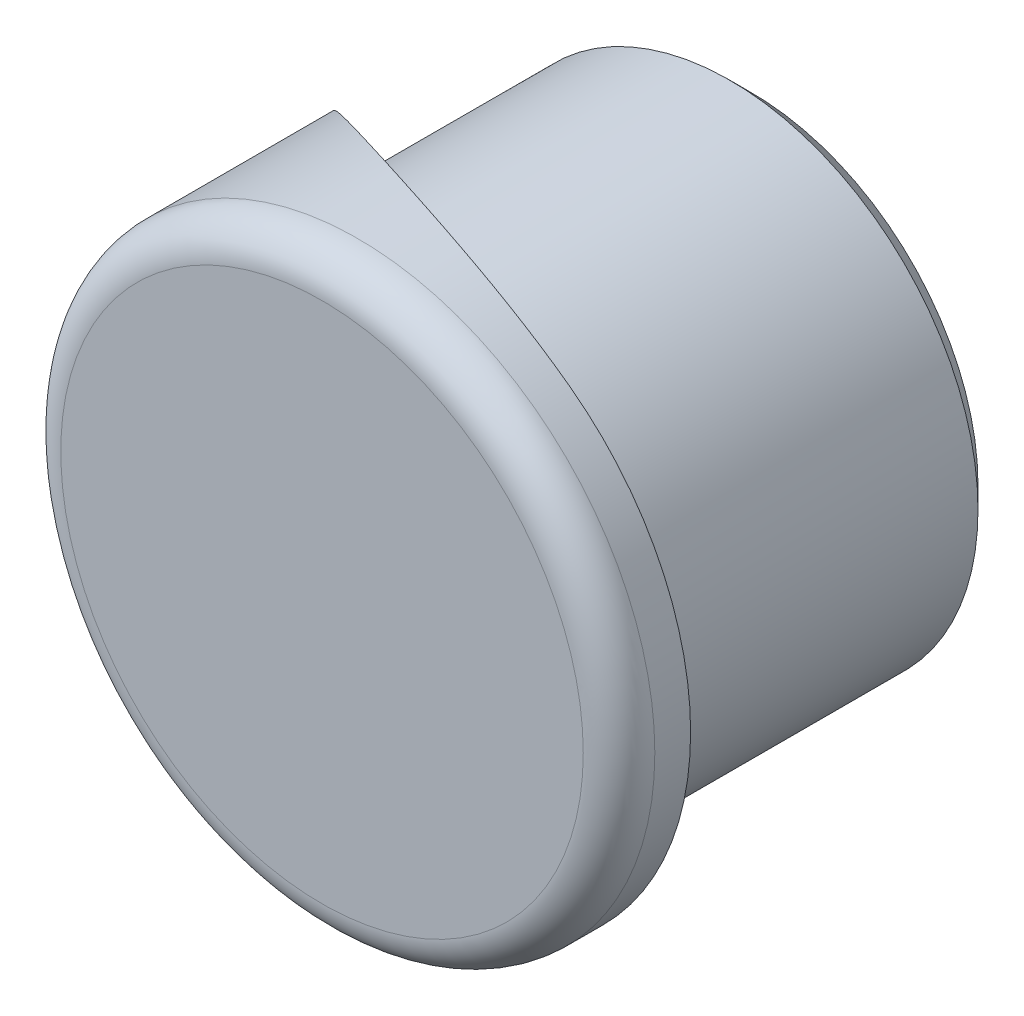
ISO-10303-21;
HEADER;
FILE_DESCRIPTION(('STEP AP214'),'2;1');
FILE_NAME('part.step','',(''),(''),'','','');
FILE_SCHEMA(('AUTOMOTIVE_DESIGN { 1 0 10303 214 1 1 1 1 }'));
ENDSEC;
DATA;
#1=APPLICATION_CONTEXT('core data for automotive mechanical design processes');
#2=APPLICATION_PROTOCOL_DEFINITION('international standard','automotive_design',2000,#1);
#3=PRODUCT_CONTEXT('',#1,'mechanical');
#4=PRODUCT('Part','Part','',(#3));
#5=PRODUCT_RELATED_PRODUCT_CATEGORY('part','',(#4));
#6=PRODUCT_DEFINITION_FORMATION('','',#4);
#7=PRODUCT_DEFINITION_CONTEXT('part definition',#1,'design');
#8=PRODUCT_DEFINITION('design','',#6,#7);
#9=PRODUCT_DEFINITION_SHAPE('','',#8);
#10=(LENGTH_UNIT() NAMED_UNIT(*) SI_UNIT(.MILLI.,.METRE.));
#11=(NAMED_UNIT(*) PLANE_ANGLE_UNIT() SI_UNIT($,.RADIAN.));
#12=(NAMED_UNIT(*) SI_UNIT($,.STERADIAN.) SOLID_ANGLE_UNIT());
#13=UNCERTAINTY_MEASURE_WITH_UNIT(LENGTH_MEASURE(1.E-05),#10,'distance_accuracy_value','');
#14=(GEOMETRIC_REPRESENTATION_CONTEXT(3) GLOBAL_UNCERTAINTY_ASSIGNED_CONTEXT((#13)) GLOBAL_UNIT_ASSIGNED_CONTEXT((#10,
#11,#12)) REPRESENTATION_CONTEXT('',''));
#15=CARTESIAN_POINT('',(0.,0.,0.));
#16=DIRECTION('',(0.,0.,1.));
#17=DIRECTION('',(1.,0.,0.));
#18=AXIS2_PLACEMENT_3D('',#15,#16,#17);
#19=CARTESIAN_POINT('',(-38.,67.,-5.));
#20=DIRECTION('',(0.,0.,1.));
#21=DIRECTION('',(1.,0.,0.));
#22=AXIS2_PLACEMENT_3D('',#19,#20,#21);
#23=CYLINDRICAL_SURFACE('',#22,3.46500000000001);
#24=DIRECTION('',(0.,0.,-1.));
#25=VECTOR('',#24,1.);
#26=CARTESIAN_POINT('',(-39.1601724009818,63.735,1.001));
#27=LINE('',#26,#25);
#28=CARTESIAN_POINT('',(-39.1601724009818,63.735,-0.868511721726009));
#29=VERTEX_POINT('',#28);
#30=CARTESIAN_POINT('',(-39.1601724009818,63.735,-4.69999999999999));
#31=VERTEX_POINT('',#30);
#32=EDGE_CURVE('E64',#29,#31,#27,.T.);
#33=ORIENTED_EDGE('',*,*,#32,.F.);
#34=CARTESIAN_POINT('',(-34.535,67.,-0.0627460668062279));
#35=CARTESIAN_POINT('',(-34.5350074828583,67.1943183308261,-0.0627397452340194));
#36=CARTESIAN_POINT('',(-34.5513990512724,67.3887328090735,-0.0606269218541209));
#37=CARTESIAN_POINT('',(-34.6165187684491,67.772108769898,-0.0528352769750474));
#38=CARTESIAN_POINT('',(-34.6652751803534,67.9610653356292,-0.0471533389198429));
#39=CARTESIAN_POINT('',(-34.7936863440667,68.3279771907534,-0.0341609407357478));
#40=CARTESIAN_POINT('',(-34.8733210423474,68.5059395334273,-0.0268515388525732));
#41=CARTESIAN_POINT('',(-35.0612788571828,68.8460481785124,-0.0134847235247043));
#42=CARTESIAN_POINT('',(-35.1695999040446,69.0081956207992,-0.00742721981286336));
#43=CARTESIAN_POINT('',(-35.4122908531092,69.3125673295976,-1.9848824931374E-05));
#44=CARTESIAN_POINT('',(-35.546732197894,69.4547350679029,0.0013169097626798));
#45=CARTESIAN_POINT('',(-35.8375088326983,69.714372122949,-0.00440306185730182));
#46=CARTESIAN_POINT('',(-35.9938382449217,69.8318480492864,-0.0114575424909256));
#47=CARTESIAN_POINT('',(-36.31859981879,70.0355890530537,-0.036853762193926));
#48=CARTESIAN_POINT('',(-36.4865560772856,70.1226528711044,-0.0548658642650128));
#49=CARTESIAN_POINT('',(-36.8327006568094,70.267849108929,-0.104021667804737));
#50=CARTESIAN_POINT('',(-37.0108858426261,70.3259903413503,-0.135161363975472));
#51=CARTESIAN_POINT('',(-37.364996887556,70.4110107857854,-0.21008917513056));
#52=CARTESIAN_POINT('',(-37.5407801681011,70.4389218816817,-0.2533915695267));
#53=CARTESIAN_POINT('',(-37.8909586667489,70.4677400662849,-0.352608484270348));
#54=CARTESIAN_POINT('',(-38.0653536221502,70.4686421602736,-0.40852533545669));
#55=CARTESIAN_POINT('',(-38.4143697719475,70.4447364380946,-0.533754545200209));
#56=CARTESIAN_POINT('',(-38.5887810118977,70.4190185979353,-0.603470578814305));
#57=CARTESIAN_POINT('',(-38.9277159067129,70.3430178646755,-0.752667993712221));
#58=CARTESIAN_POINT('',(-39.092236922051,70.2927284462526,-0.832151964807883));
#59=CARTESIAN_POINT('',(-39.4287056141085,70.1625175806226,-1.0086124809165));
#60=CARTESIAN_POINT('',(-39.5990231124474,70.0796840590618,-1.1065345077834));
#61=CARTESIAN_POINT('',(-39.9221112028096,69.8891109002179,-1.30750476649196));
#62=CARTESIAN_POINT('',(-40.0748573789693,69.7813372190298,-1.41055985279682));
#63=CARTESIAN_POINT('',(-40.3001850192607,69.5936179275805,-1.57323034339637));
#64=CARTESIAN_POINT('',(-40.3792934508889,69.5212519080298,-1.63273487209901));
#65=CARTESIAN_POINT('',(-40.5308171263053,69.3691176199974,-1.75091764445916));
#66=CARTESIAN_POINT('',(-40.6032306910346,69.2893475045818,-1.80959567772242));
#67=CARTESIAN_POINT('',(-40.7408738750764,69.122618768717,-1.92489269931408));
#68=CARTESIAN_POINT('',(-40.8061108066616,69.0356676262202,-1.98151374335076));
#69=CARTESIAN_POINT('',(-40.9289667402705,68.8545490171092,-2.09136921523375));
#70=CARTESIAN_POINT('',(-40.9865864509023,68.7603822230355,-2.14460395785853));
#71=CARTESIAN_POINT('',(-41.1116413069467,68.5317208403521,-2.26320911837599));
#72=CARTESIAN_POINT('',(-41.1758098508866,68.3943546593738,-2.32659840662755));
#73=CARTESIAN_POINT('',(-41.2868414246971,68.1074524539752,-2.43919059384887));
#74=CARTESIAN_POINT('',(-41.333739297442,67.95794168332,-2.48842201126488));
#75=CARTESIAN_POINT('',(-41.4012381027768,67.674752310029,-2.56039661183033));
#76=CARTESIAN_POINT('',(-41.4249243390676,67.5426047389453,-2.58619187321985));
#77=CARTESIAN_POINT('',(-41.4567595673716,67.2742959208186,-2.62102705602521));
#78=CARTESIAN_POINT('',(-41.4649223706207,67.1381383511286,-2.63008187125645));
#79=CARTESIAN_POINT('',(-41.4650766190862,66.8656077721054,-2.63025221382331));
#80=CARTESIAN_POINT('',(-41.4570452369416,66.7292347297963,-2.62134241820288));
#81=CARTESIAN_POINT('',(-41.4254201773638,66.4604752519239,-2.58673186010538));
#82=CARTESIAN_POINT('',(-41.4018116476935,66.3280927472819,-2.56101507300279));
#83=CARTESIAN_POINT('',(-41.3325541106972,66.0365421258207,-2.48714982093731));
#84=CARTESIAN_POINT('',(-41.2827567470808,65.8794185769826,-2.43489480775135));
#85=CARTESIAN_POINT('',(-41.1642447082799,65.5787173885951,-2.31504573198983));
#86=CARTESIAN_POINT('',(-41.0954875341257,65.4351711654703,-2.24741726990643));
#87=CARTESIAN_POINT('',(-40.913507282884,65.1122654062499,-2.07611775918953));
#88=CARTESIAN_POINT('',(-40.7932251351466,64.939085813274,-1.96832580654472));
#89=CARTESIAN_POINT('',(-40.5264718343559,64.6195490537807,-1.74575899307786));
#90=CARTESIAN_POINT('',(-40.3799733639548,64.4732201909091,-1.6309769316767));
#91=CARTESIAN_POINT('',(-40.0602272104819,64.206109621311,-1.39985371892978));
#92=CARTESIAN_POINT('',(-39.8865387642131,64.0858448846385,-1.28352251435435));
#93=CARTESIAN_POINT('',(-39.5168724213005,63.8774596244126,-1.05799081451405));
#94=CARTESIAN_POINT('',(-39.3209217326029,63.7893004057051,-0.948781866413846));
#95=CARTESIAN_POINT('',(-38.9395679022534,63.6596620270591,-0.75793372873985));
#96=CARTESIAN_POINT('',(-38.7567135375312,63.6132869728886,-0.67458942298845));
#97=CARTESIAN_POINT('',(-38.4749071532384,63.5663742667939,-0.559077602265383));
#98=CARTESIAN_POINT('',(-38.3796849409183,63.5545115050318,-0.522147169578461));
#99=CARTESIAN_POINT('',(-38.1873270808172,63.5387238849914,-0.451780194695325));
#100=CARTESIAN_POINT('',(-38.0901922666342,63.5347956425739,-0.418342168731279));
#101=CARTESIAN_POINT('',(-37.8941250605487,63.5352220756273,-0.355053296604298));
#102=CARTESIAN_POINT('',(-37.7951853451538,63.5396270537601,-0.325225399424831));
#103=CARTESIAN_POINT('',(-37.5969727945843,63.5570818269826,-0.269614782513644));
#104=CARTESIAN_POINT('',(-37.4977001325196,63.5701276661709,-0.243830218367751));
#105=CARTESIAN_POINT('',(-37.2997165138212,63.605013853424,-0.196402265872657));
#106=CARTESIAN_POINT('',(-37.2010055156736,63.6268535427222,-0.174758567501237));
#107=CARTESIAN_POINT('',(-37.0051232388711,63.6793488837617,-0.135604839021669));
#108=CARTESIAN_POINT('',(-36.9079518222546,63.7100037408094,-0.118094436552957));
#109=CARTESIAN_POINT('',(-36.7255821639484,63.7765609938262,-0.0886037010025468));
#110=CARTESIAN_POINT('',(-36.6401465121954,63.8116504002299,-0.0762487889400474));
#111=CARTESIAN_POINT('',(-36.4720078635883,63.8887267815483,-0.0546111742862782));
#112=CARTESIAN_POINT('',(-36.3893057627188,63.9307159916252,-0.0453294701950434));
#113=CARTESIAN_POINT('',(-36.2273713900952,64.0213069484541,-0.0296025608239107));
#114=CARTESIAN_POINT('',(-36.1481375229856,64.0699056117538,-0.0231560387730934));
#115=CARTESIAN_POINT('',(-35.9937075690325,64.1733990933973,-0.0127859524565111));
#116=CARTESIAN_POINT('',(-35.918513021294,64.2282962870392,-0.00886334371697891));
#117=CARTESIAN_POINT('',(-35.7019365022556,64.4002488911629,-0.000452683275712521));
#118=CARTESIAN_POINT('',(-35.5671268381139,64.5259318928098,0.000890983295654131));
#119=CARTESIAN_POINT('',(-35.3191900065987,64.7969809115625,-0.00194537570822346));
#120=CARTESIAN_POINT('',(-35.2060703825676,64.9423537464961,-0.00612731899949184));
#121=CARTESIAN_POINT('',(-35.0000954900911,65.2554833843794,-0.0172081562618088));
#122=CARTESIAN_POINT('',(-34.9082748190511,65.4239183380095,-0.0242125059200326));
#123=CARTESIAN_POINT('',(-34.7536950676086,65.7735338348096,-0.0378625625272083));
#124=CARTESIAN_POINT('',(-34.6909147302128,65.9547049430861,-0.0445085286482653));
#125=CARTESIAN_POINT('',(-34.6075076699568,66.2801119756775,-0.0538667703292835));
#126=CARTESIAN_POINT('',(-34.5803609913239,66.4226956706784,-0.0571415069074745));
#127=CARTESIAN_POINT('',(-34.544104460019,66.7101684286885,-0.0615835017525356));
#128=CARTESIAN_POINT('',(-34.5349944185171,66.8550574675466,-0.0627507820828623));
#129=CARTESIAN_POINT('',(-34.535,67.,-0.0627460668062279));
#130=B_SPLINE_CURVE_WITH_KNOTS('',3,(#34,#35,#36,#37,#38,#39,#40,#41,#42,#43,#44,#45,#46,#47,
#48,#49,#50,#51,#52,#53,#54,#55,#56,#57,#58,#59,#60,#61,#62,#63,#64,#65,#66,#67,#68,#69,#70,#71,
#72,#73,#74,#75,#76,#77,#78,#79,#80,#81,#82,#83,#84,#85,#86,#87,#88,#89,#90,#91,#92,#93,#94,#95,
#96,#97,#98,#99,#100,#101,#102,#103,#104,#105,#106,#107,#108,#109,#110,#111,#112,#113,#114,#115,
#116,#117,#118,#119,#120,#121,#122,#123,#124,#125,#126,#127,#128,#129),.UNSPECIFIED.,.T.,.F.,(4,
2,2,2,2,2,2,2,2,2,2,2,2,2,2,2,2,2,2,2,2,2,2,2,2,2,2,2,2,2,2,2,2,2,2,2,2,2,2,2,2,2,2,2,2,2,2,4),
(0.,0.582428361334653,1.16536600827761,1.7479257058215,2.3304433836839,2.91457734547986,
3.4985547444113,4.0657778868494,4.63282809163637,5.17984505785919,5.72696318216146,
6.29342302306707,6.86003337704985,7.49726574457342,8.13537313438889,8.50288714096622,
8.87049307067518,9.23772090803059,9.60491455916375,10.0962387207205,10.5865661539456,
10.9949327909254,11.4029359328357,11.8115145989667,12.2204833938603,12.7363627601776,
13.2534080191204,13.9601295530194,14.6675918230913,15.3880110231279,16.1075590420949,
16.7234233307964,17.0315585676661,17.3395623544863,17.6494313102788,17.9591585018989,
18.2688624954912,18.5785385777975,18.8577476333399,19.1370473164309,19.4162171443392,
19.6954926008281,20.245747786814,20.7961939943224,21.3694615591081,21.9423088358998,
22.3767481660378,22.8111829479015),.UNSPECIFIED.);
#131=CARTESIAN_POINT('',(-35.535,69.4351591323772,0.));
#132=VERTEX_POINT('',#131);
#133=EDGE_CURVE('E103',#132,#29,#130,.T.);
#134=ORIENTED_EDGE('',*,*,#133,.F.);
#135=CARTESIAN_POINT('',(-38.,67.,0.));
#136=DIRECTION('',(0.,0.,1.));
#137=DIRECTION('',(1.,0.,0.));
#138=AXIS2_PLACEMENT_3D('',#135,#136,#137);
#139=CIRCLE('',#138,3.46500000000001);
#140=CARTESIAN_POINT('',(-35.535,64.5648408676228,0.));
#141=VERTEX_POINT('',#140);
#142=EDGE_CURVE('E107',#141,#132,#139,.T.);
#143=ORIENTED_EDGE('',*,*,#142,.F.);
#144=CARTESIAN_POINT('',(-36.8398275990181,63.735,-0.107128219916371));
#145=VERTEX_POINT('',#144);
#146=EDGE_CURVE('E100',#145,#141,#130,.T.);
#147=ORIENTED_EDGE('',*,*,#146,.F.);
#148=DIRECTION('',(0.,0.,-1.));
#149=VECTOR('',#148,1.);
#150=CARTESIAN_POINT('',(-36.8398275990181,63.735,1.001));
#151=LINE('',#150,#149);
#152=CARTESIAN_POINT('',(-36.8398275990181,63.735,-4.69999999999999));
#153=VERTEX_POINT('',#152);
#154=EDGE_CURVE('E88',#145,#153,#151,.T.);
#155=ORIENTED_EDGE('',*,*,#154,.T.);
#156=CARTESIAN_POINT('',(-38.,67.,-4.69999999999999));
#157=DIRECTION('',(0.,0.,1.));
#158=DIRECTION('',(1.,0.,0.));
#159=AXIS2_PLACEMENT_3D('',#156,#157,#158);
#160=CIRCLE('',#159,3.46500000000001);
#161=EDGE_CURVE('E151',#153,#31,#160,.T.);
#162=ORIENTED_EDGE('',*,*,#161,.T.);
#163=EDGE_LOOP('',(#33,#134,#143,#147,#155,#162));
#164=FACE_BOUND('',#163,.T.);
#165=ADVANCED_FACE('F43',(#164),#23,.T.);
#166=CARTESIAN_POINT('',(-38.,67.,-5.));
#167=DIRECTION('',(0.,0.,1.));
#168=DIRECTION('',(1.,0.,0.));
#169=AXIS2_PLACEMENT_3D('',#166,#167,#168);
#170=PLANE('',#169);
#171=CARTESIAN_POINT('',(-38.,67.,-5.));
#172=DIRECTION('',(0.,0.,1.));
#173=DIRECTION('',(1.,0.,0.));
#174=AXIS2_PLACEMENT_3D('',#171,#172,#173);
#175=CIRCLE('',#174,3.165);
#176=CARTESIAN_POINT('',(-34.835,67.,-5.));
#177=VERTEX_POINT('',#176);
#178=EDGE_CURVE('E58',#177,#177,#175,.F.);
#179=ORIENTED_EDGE('',*,*,#178,.T.);
#180=EDGE_LOOP('',(#179));
#181=FACE_BOUND('',#180,.T.);
#182=ADVANCED_FACE('F141',(#181),#170,.F.);
#183=CARTESIAN_POINT('',(-38.,67.,1.));
#184=DIRECTION('',(0.,0.,-1.));
#185=DIRECTION('',(-1.,0.,0.));
#186=AXIS2_PLACEMENT_3D('',#183,#184,#185);
#187=CYLINDRICAL_SURFACE('',#186,4.15);
#188=CARTESIAN_POINT('',(-35.535,70.3386037500728,0.));
#189=CARTESIAN_POINT('',(-35.621149734338,70.4022300541031,9.97788731530421E-06));
#190=CARTESIAN_POINT('',(-35.7097886912923,70.4625032790938,-0.0013910973962824));
#191=CARTESIAN_POINT('',(-35.891390648936,70.5759892293937,-0.00742856745871159));
#192=CARTESIAN_POINT('',(-35.9843543743296,70.6292007655738,-0.0120655063091064));
#193=CARTESIAN_POINT('',(-36.1737808074708,70.7281136031343,-0.0249785700638338));
#194=CARTESIAN_POINT('',(-36.2702380951678,70.7738259769767,-0.0332492621140484));
#195=CARTESIAN_POINT('',(-36.4660193441792,70.8575555819815,-0.0537501990777097));
#196=CARTESIAN_POINT('',(-36.5653430262157,70.8955735599502,-0.065980059420615));
#197=CARTESIAN_POINT('',(-36.7662217798506,70.9637809709194,-0.094659958296088));
#198=CARTESIAN_POINT('',(-36.8677800319631,70.9939583413931,-0.111116422891139));
#199=CARTESIAN_POINT('',(-37.0721860163087,71.0463314618807,-0.148385018139984));
#200=CARTESIAN_POINT('',(-37.1750342117769,71.068524254361,-0.169198758247341));
#201=CARTESIAN_POINT('',(-37.3810719986416,71.1049187619388,-0.215198034918052));
#202=CARTESIAN_POINT('',(-37.484261215346,71.1191274099039,-0.240379753690293));
#203=CARTESIAN_POINT('',(-37.6902892591051,71.1397243925692,-0.295058648039326));
#204=CARTESIAN_POINT('',(-37.7931279378587,71.1461097488914,-0.324557462381094));
#205=CARTESIAN_POINT('',(-38.0990058456441,71.1538016527018,-0.419031722116995));
#206=CARTESIAN_POINT('',(-38.3005323035065,71.1438357568197,-0.490235171971284));
#207=CARTESIAN_POINT('',(-38.6943405827577,71.0963237147095,-0.647198376422936));
#208=CARTESIAN_POINT('',(-38.8866159301259,71.0587585449534,-0.732968139869193));
#209=CARTESIAN_POINT('',(-39.2781994311725,70.9539799333864,-0.926039704851712));
#210=CARTESIAN_POINT('',(-39.4761339998637,70.8840726818758,-1.03465592879544));
#211=CARTESIAN_POINT('',(-39.8541604667197,70.7185018059244,-1.26251460247421));
#212=CARTESIAN_POINT('',(-40.0342444695053,70.6228268532517,-1.38176171039333));
#213=CARTESIAN_POINT('',(-40.4079459669177,70.3884801062175,-1.65044743810582));
#214=CARTESIAN_POINT('',(-40.597605540439,70.2450893914401,-1.80130982383197));
#215=CARTESIAN_POINT('',(-40.8609740919549,70.0085330905618,-2.02943877222425));
#216=CARTESIAN_POINT('',(-40.9453125984398,69.9260151632161,-2.10586015276671));
#217=CARTESIAN_POINT('',(-41.1068429019321,69.7538980227786,-2.25832184520318));
#218=CARTESIAN_POINT('',(-41.1840357200266,69.6642998248284,-2.33436221006925));
#219=CARTESIAN_POINT('',(-41.322570762054,69.48878270077,-2.47617053853203));
#220=CARTESIAN_POINT('',(-41.3847140601796,69.4036332028303,-2.54211094328518));
#221=CARTESIAN_POINT('',(-41.5030491272354,69.227642892924,-2.67176494992621));
#222=CARTESIAN_POINT('',(-41.5592400560847,69.1368012804791,-2.73547823664444));
#223=CARTESIAN_POINT('',(-41.665242949536,68.949376068847,-2.85930466332917));
#224=CARTESIAN_POINT('',(-41.7150655687376,68.8528024669282,-2.91942372451416));
#225=CARTESIAN_POINT('',(-41.8079208632302,68.6535738898166,-3.03452586103224));
#226=CARTESIAN_POINT('',(-41.8509571589748,68.5509221977227,-3.08951166848664));
#227=CARTESIAN_POINT('',(-41.9400020794973,68.3112198172243,-3.2059801401198));
#228=CARTESIAN_POINT('',(-41.9837776461555,68.1722605988536,-3.26532480370467));
#229=CARTESIAN_POINT('',(-42.057303737599,67.8846814589757,-3.36712228618242));
#230=CARTESIAN_POINT('',(-42.0870776996239,67.7360781587154,-3.4096033143421));
#231=CARTESIAN_POINT('',(-42.1196545393601,67.5069889526605,-3.45657818316439));
#232=CARTESIAN_POINT('',(-42.1285179327644,67.4290290907458,-3.46947523080156));
#233=CARTESIAN_POINT('',(-42.1418271981599,67.2719640829614,-3.48890497850318));
#234=CARTESIAN_POINT('',(-42.146275437183,67.1928595738598,-3.49544108872696));
#235=CARTESIAN_POINT('',(-42.1506159921754,67.0342804952256,-3.50181804444513));
#236=CARTESIAN_POINT('',(-42.1505099518333,66.9548060695544,-3.50166130546114));
#237=CARTESIAN_POINT('',(-42.1457577173818,66.7963109065401,-3.49468146207131));
#238=CARTESIAN_POINT('',(-42.1411117739305,66.7172901443915,-3.48785872571004));
#239=CARTESIAN_POINT('',(-42.1226710420433,66.5063084512029,-3.46094321176935));
#240=CARTESIAN_POINT('',(-42.1047767374504,66.3754149384127,-3.43494417526041));
#241=CARTESIAN_POINT('',(-42.0576711373917,66.1197778104037,-3.36789275017013));
#242=CARTESIAN_POINT('',(-42.0284484683299,65.995040518324,-3.3268252351691));
#243=CARTESIAN_POINT('',(-41.938424105908,65.6757216330552,-3.20364868376931));
#244=CARTESIAN_POINT('',(-41.8693552210958,65.4871209147776,-3.11204210216894));
#245=CARTESIAN_POINT('',(-41.7496488275425,65.2189096061747,-2.96191150540608));
#246=CARTESIAN_POINT('',(-41.7069583174388,65.1317901286845,-2.90962708772035));
#247=CARTESIAN_POINT('',(-41.6165209736787,64.9622335423753,-2.80192087720521));
#248=CARTESIAN_POINT('',(-41.5687755986897,64.8797950932582,-2.74649999159404));
#249=CARTESIAN_POINT('',(-41.4454187980974,64.6825269922964,-2.60749487532135));
#250=CARTESIAN_POINT('',(-41.3670965737677,64.5702539761808,-2.52268919158844));
#251=CARTESIAN_POINT('',(-41.2007561345196,64.3549740283499,-2.35079369263376));
#252=CARTESIAN_POINT('',(-41.11273392402,64.2519709470473,-2.26370294749724));
#253=CARTESIAN_POINT('',(-40.9272480471819,64.0551723192798,-2.08900141962104));
#254=CARTESIAN_POINT('',(-40.8297789268541,63.9613821553812,-2.00139036421794));
#255=CARTESIAN_POINT('',(-40.6256479550161,63.7833546576313,-1.82721248993594));
#256=CARTESIAN_POINT('',(-40.51898754967,63.6991158257783,-1.740645509216));
#257=CARTESIAN_POINT('',(-40.295600065211,63.5399857376943,-1.56908207760355));
#258=CARTESIAN_POINT('',(-40.1787883657915,63.4651890041383,-1.48410780857447));
#259=CARTESIAN_POINT('',(-39.9362146915564,63.326707927993,-1.31786507778241));
#260=CARTESIAN_POINT('',(-39.8104514774756,63.2630251282678,-1.23659713169533));
#261=CARTESIAN_POINT('',(-39.5507415425119,63.148010410839,-1.07924712449723));
#262=CARTESIAN_POINT('',(-39.4168140318465,63.0966508046087,-1.00315371811003));
#263=CARTESIAN_POINT('',(-39.1412914275855,63.0073947577174,-0.857246688552897));
#264=CARTESIAN_POINT('',(-38.9997001638769,62.969491662592,-0.787429974248189));
#265=CARTESIAN_POINT('',(-38.7536187374007,62.9176881360405,-0.675186253483159));
#266=CARTESIAN_POINT('',(-38.6507872388791,62.899997015764,-0.630839735664617));
#267=CARTESIAN_POINT('',(-38.4424663390722,62.8723182176902,-0.546191049599258));
#268=CARTESIAN_POINT('',(-38.3369775938528,62.8623286572844,-0.50588789506883));
#269=CARTESIAN_POINT('',(-38.1240190757947,62.8504835160342,-0.429678663553128));
#270=CARTESIAN_POINT('',(-38.0165501849225,62.8486243977854,-0.393770680921393));
#271=CARTESIAN_POINT('',(-37.8003957257081,62.8533944498819,-0.326618573842586));
#272=CARTESIAN_POINT('',(-37.6917107321461,62.8600197652639,-0.29537233849738));
#273=CARTESIAN_POINT('',(-37.4734264393175,62.8820746704145,-0.237570675199494));
#274=CARTESIAN_POINT('',(-37.3638252451136,62.8975456102861,-0.211038050627183));
#275=CARTESIAN_POINT('',(-37.1452174368648,62.9374653341368,-0.162926449833455));
#276=CARTESIAN_POINT('',(-37.0362105990434,62.96191046268,-0.14134546248093));
#277=CARTESIAN_POINT('',(-36.8196880309767,63.0198085922372,-0.103059695581478));
#278=CARTESIAN_POINT('',(-36.7121729381718,63.0532653264954,-0.086356942935063));
#279=CARTESIAN_POINT('',(-36.4997166409823,63.1290342266482,-0.0576565211826744));
#280=CARTESIAN_POINT('',(-36.3947747532734,63.171344012496,-0.0456575899916048));
#281=CARTESIAN_POINT('',(-36.1583270567898,63.2781618305281,-0.0231998617180084));
#282=CARTESIAN_POINT('',(-36.0279614313968,63.3455478553904,-0.0142012965228459));
#283=CARTESIAN_POINT('',(-35.8383520832952,63.4566752468835,-0.00550247576620109));
#284=CARTESIAN_POINT('',(-35.7761825251012,63.4953601800732,-0.00340249077808284));
#285=CARTESIAN_POINT('',(-35.6539628922731,63.5759726252026,-0.000651295242969269));
#286=CARTESIAN_POINT('',(-35.5939124819151,63.6178996201328,1.45811411729192E-07));
#287=CARTESIAN_POINT('',(-35.535,63.6613962499272,0.));
#288=B_SPLINE_CURVE_WITH_KNOTS('',3,(#188,#189,#190,#191,#192,#193,#194,#195,#196,#197,#198,
#199,#200,#201,#202,#203,#204,#205,#206,#207,#208,#209,#210,#211,#212,#213,#214,#215,#216,#217,
#218,#219,#220,#221,#222,#223,#224,#225,#226,#227,#228,#229,#230,#231,#232,#233,#234,#235,#236,
#237,#238,#239,#240,#241,#242,#243,#244,#245,#246,#247,#248,#249,#250,#251,#252,#253,#254,#255,
#256,#257,#258,#259,#260,#261,#262,#263,#264,#265,#266,#267,#268,#269,#270,#271,#272,#273,#274,
#275,#276,#277,#278,#279,#280,#281,#282,#283,#284,#285,#286,#287),.UNSPECIFIED.,.F.,.F.,(4,2,2,
2,2,2,2,2,2,2,2,2,2,2,2,2,2,2,2,2,2,2,2,2,2,2,2,2,2,2,2,2,2,2,2,2,2,2,2,2,2,2,2,2,2,2,2,2,2,4),
(0.,0.321221500702226,0.642497023955763,0.963293831514757,1.28405948808572,1.60531574883522,
1.92669088253778,2.24778652381939,2.56900437035392,3.20797650121413,3.84738947416761,
4.55379092035417,5.26050342955346,6.10185439489669,6.5233208077052,6.94472690156746,
7.31748234625757,7.69029032946046,8.06246618064123,8.43444280205454,8.90496512301134,
9.37469700981861,9.61291078678694,9.85099678460687,10.0889968553439,10.3269837863096,
10.7290728334361,11.1315666249754,11.7898020789965,12.1202824951092,12.4506678040694,
12.9331262055341,13.4157840875622,13.8987223016408,14.381584668093,14.8689511187794,
15.3563851731661,15.8427135533749,16.3288011001654,16.668598660037,17.0083131317026,
17.3478797851988,17.6872922088791,18.0283043889903,18.3691778192289,18.7101926811202,
19.051115982387,19.491086719868,19.7107480072834,19.9303743374065),.UNSPECIFIED.);
#289=CARTESIAN_POINT('',(-35.535,70.3386037500728,0.));
#290=VERTEX_POINT('',#289);
#291=CARTESIAN_POINT('',(-35.535,63.6613962499272,0.));
#292=VERTEX_POINT('',#291);
#293=EDGE_CURVE('E71',#290,#292,#288,.T.);
#294=ORIENTED_EDGE('',*,*,#293,.T.);
#295=CARTESIAN_POINT('',(-38.,67.,0.));
#296=DIRECTION('',(0.,0.,1.));
#297=DIRECTION('',(1.,0.,0.));
#298=AXIS2_PLACEMENT_3D('',#295,#296,#297);
#299=CIRCLE('',#298,4.15);
#300=EDGE_CURVE('E109',#292,#290,#299,.T.);
#301=ORIENTED_EDGE('',*,*,#300,.T.);
#302=EDGE_LOOP('',(#294,#301));
#303=FACE_BOUND('',#302,.T.);
#304=CARTESIAN_POINT('',(-38.,67.,0.5));
#305=DIRECTION('',(0.,0.,1.));
#306=DIRECTION('',(1.,0.,0.));
#307=AXIS2_PLACEMENT_3D('',#304,#305,#306);
#308=CIRCLE('',#307,4.15);
#309=CARTESIAN_POINT('',(-33.85,67.,0.5));
#310=VERTEX_POINT('',#309);
#311=EDGE_CURVE('E158',#310,#310,#308,.F.);
#312=ORIENTED_EDGE('',*,*,#311,.T.);
#313=EDGE_LOOP('',(#312));
#314=FACE_BOUND('',#313,.T.);
#315=ADVANCED_FACE('F135',(#303,#314),#187,.T.);
#316=CARTESIAN_POINT('',(-38.,67.,1.));
#317=DIRECTION('',(0.,0.,1.));
#318=DIRECTION('',(1.,0.,0.));
#319=AXIS2_PLACEMENT_3D('',#316,#317,#318);
#320=PLANE('',#319);
#321=CARTESIAN_POINT('',(-38.,67.,1.));
#322=DIRECTION('',(0.,0.,1.));
#323=DIRECTION('',(1.,0.,0.));
#324=AXIS2_PLACEMENT_3D('',#321,#322,#323);
#325=CIRCLE('',#324,3.65);
#326=CARTESIAN_POINT('',(-34.35,67.,1.));
#327=VERTEX_POINT('',#326);
#328=EDGE_CURVE('E161',#327,#327,#325,.T.);
#329=ORIENTED_EDGE('',*,*,#328,.T.);
#330=EDGE_LOOP('',(#329));
#331=FACE_BOUND('',#330,.T.);
#332=ADVANCED_FACE('F130',(#331),#320,.T.);
#333=CARTESIAN_POINT('',(-38.,67.,0.));
#334=DIRECTION('',(0.,0.,1.));
#335=DIRECTION('',(1.,0.,0.));
#336=AXIS2_PLACEMENT_3D('',#333,#334,#335);
#337=PLANE('',#336);
#338=ORIENTED_EDGE('',*,*,#300,.F.);
#339=DIRECTION('',(0.,-1.,0.));
#340=VECTOR('',#339,1.);
#341=CARTESIAN_POINT('',(-35.535,73.15,0.));
#342=LINE('',#341,#340);
#343=EDGE_CURVE('E152',#292,#141,#342,.F.);
#344=ORIENTED_EDGE('',*,*,#343,.T.);
#345=ORIENTED_EDGE('',*,*,#142,.T.);
#346=EDGE_CURVE('E155',#132,#290,#342,.F.);
#347=ORIENTED_EDGE('',*,*,#346,.T.);
#348=EDGE_LOOP('',(#338,#344,#345,#347));
#349=FACE_BOUND('',#348,.T.);
#350=ADVANCED_FACE('F134',(#349),#337,.F.);
#351=CARTESIAN_POINT('',(-38.,67.,0.5));
#352=DIRECTION('',(0.,0.,1.));
#353=DIRECTION('',(1.,0.,0.));
#354=AXIS2_PLACEMENT_3D('',#351,#352,#353);
#355=TOROIDAL_SURFACE('',#354,3.65,0.5);
#356=ORIENTED_EDGE('',*,*,#311,.F.);
#357=EDGE_LOOP('',(#356));
#358=FACE_BOUND('',#357,.T.);
#359=ORIENTED_EDGE('',*,*,#328,.F.);
#360=EDGE_LOOP('',(#359));
#361=FACE_BOUND('',#360,.T.);
#362=ADVANCED_FACE('F128',(#358,#361),#355,.T.);
#363=CARTESIAN_POINT('',(-35.535,73.15,-8.));
#364=DIRECTION('',(0.,-1.,0.));
#365=DIRECTION('',(0.,0.,-1.));
#366=AXIS2_PLACEMENT_3D('',#363,#364,#365);
#367=CYLINDRICAL_SURFACE('',#366,8.);
#368=ORIENTED_EDGE('',*,*,#293,.F.);
#369=ORIENTED_EDGE('',*,*,#346,.F.);
#370=ORIENTED_EDGE('',*,*,#133,.T.);
#371=CARTESIAN_POINT('',(-35.535,63.735,-8.));
#372=DIRECTION('',(0.,1.,0.));
#373=DIRECTION('',(0.,0.,1.));
#374=AXIS2_PLACEMENT_3D('',#371,#372,#373);
#375=CIRCLE('',#374,8.);
#376=EDGE_CURVE('E91',#145,#29,#375,.F.);
#377=ORIENTED_EDGE('',*,*,#376,.F.);
#378=ORIENTED_EDGE('',*,*,#146,.T.);
#379=ORIENTED_EDGE('',*,*,#343,.F.);
#380=EDGE_LOOP('',(#368,#369,#370,#377,#378,#379));
#381=FACE_BOUND('',#380,.T.);
#382=ADVANCED_FACE('F99',(#381),#367,.F.);
#383=CARTESIAN_POINT('',(-38.,67.,-4.69999999999999));
#384=DIRECTION('',(0.,0.,1.));
#385=DIRECTION('',(1.,0.,0.));
#386=AXIS2_PLACEMENT_3D('',#383,#384,#385);
#387=CONICAL_SURFACE('',#386,3.46500000000001,0.785398163397445);
#388=CARTESIAN_POINT('',(-41.5000304956615,63.735,-3.37851501929017));
#389=CARTESIAN_POINT('',(-41.4073097162154,63.735,-3.44629582259966));
#390=CARTESIAN_POINT('',(-41.3140023981493,63.735,-3.51328979761067));
#391=CARTESIAN_POINT('',(-41.1259726333377,63.735,-3.64533198767482));
#392=CARTESIAN_POINT('',(-41.0312496882792,63.735,-3.71037949215272));
#393=CARTESIAN_POINT('',(-40.8391713301283,63.735,-3.8388037710258));
#394=CARTESIAN_POINT('',(-40.7417984728391,63.735,-3.90215458257666));
#395=CARTESIAN_POINT('',(-40.5451867661703,63.735,-4.02587464168213));
#396=CARTESIAN_POINT('',(-40.4459480965798,63.735,-4.08624417449938));
#397=CARTESIAN_POINT('',(-40.2407620726927,63.735,-4.20596144053571));
#398=CARTESIAN_POINT('',(-40.1347143248441,63.735,-4.26513939244383));
#399=CARTESIAN_POINT('',(-39.9199570494791,63.735,-4.37842710744736));
#400=CARTESIAN_POINT('',(-39.8112470100975,63.735,-4.43253588611423));
#401=CARTESIAN_POINT('',(-39.4815333548203,63.735,-4.58487866456475));
#402=CARTESIAN_POINT('',(-39.2558598550515,63.735,-4.67379274632277));
#403=CARTESIAN_POINT('',(-38.9156500939356,63.735,-4.77561615660854));
#404=CARTESIAN_POINT('',(-38.8056687673872,63.735,-4.80382262434721));
#405=CARTESIAN_POINT('',(-38.5835202988007,63.735,-4.85004479347588));
#406=CARTESIAN_POINT('',(-38.4713529568822,63.735,-4.86805955841336));
#407=CARTESIAN_POINT('',(-38.2476516217427,63.735,-4.89247595176349));
#408=CARTESIAN_POINT('',(-38.136138727804,63.735,-4.899067881985));
#409=CARTESIAN_POINT('',(-37.913026979188,63.735,-4.90074703131184));
#410=CARTESIAN_POINT('',(-37.8014281278199,63.735,-4.89583467314017));
#411=CARTESIAN_POINT('',(-37.5796734612631,63.735,-4.87490201602421));
#412=CARTESIAN_POINT('',(-37.469514086575,63.735,-4.85891862906776));
#413=CARTESIAN_POINT('',(-37.2511368213984,63.735,-4.81693724159067));
#414=CARTESIAN_POINT('',(-37.1429192714907,63.735,-4.79093750190502));
#415=CARTESIAN_POINT('',(-36.9272054769673,63.735,-4.72985437581919));
#416=CARTESIAN_POINT('',(-36.8197498331781,63.735,-4.69462965713022));
#417=CARTESIAN_POINT('',(-36.6075663978503,63.735,-4.61685185435295));
#418=CARTESIAN_POINT('',(-36.5028385458846,63.735,-4.57429893276086));
#419=CARTESIAN_POINT('',(-36.2261595873405,63.735,-4.45252602281406));
#420=CARTESIAN_POINT('',(-36.0565748989792,63.735,-4.3679510824348));
#421=CARTESIAN_POINT('',(-35.7235732994778,63.735,-4.18721456350917));
#422=CARTESIAN_POINT('',(-35.5601647313561,63.735,-4.09103799938604));
#423=CARTESIAN_POINT('',(-35.245104779484,63.735,-3.89473670810284));
#424=CARTESIAN_POINT('',(-35.0932468071591,63.735,-3.79494083383217));
#425=CARTESIAN_POINT('',(-34.8685118239639,63.735,-3.6413418486904));
#426=CARTESIAN_POINT('',(-34.7942248722909,63.735,-3.58957696788368));
#427=CARTESIAN_POINT('',(-34.6464932782878,63.735,-3.48487991588124));
#428=CARTESIAN_POINT('',(-34.5730485182876,63.735,-3.43194791085157));
#429=CARTESIAN_POINT('',(-34.4999695043385,63.735,-3.37851501929017));
#430=B_SPLINE_CURVE_WITH_KNOTS('',3,(#388,#389,#390,#391,#392,#393,#394,#395,#396,#397,#398,
#399,#400,#401,#402,#403,#404,#405,#406,#407,#408,#409,#410,#411,#412,#413,#414,#415,#416,#417,
#418,#419,#420,#421,#422,#423,#424,#425,#426,#427,#428,#429),.UNSPECIFIED.,.F.,.F.,(4,2,2,2,2,2,
2,2,2,2,2,2,2,2,2,2,2,2,2,2,4),(0.,0.344570424727484,0.689265140052036,1.03771966017418,
1.38614077368428,1.75032442258014,2.11457864961575,2.83928189997368,3.17951939898815,
3.51978815524621,3.85433156762477,4.18886268745854,4.5222837801987,4.85576279181,
5.19468466713834,5.53359902815062,6.10139700648895,6.66993641315601,7.2149117530888,
7.48653448358235,7.75811878910975),.UNSPECIFIED.);
#431=EDGE_CURVE('E11',#31,#153,#430,.T.);
#432=ORIENTED_EDGE('',*,*,#431,.F.);
#433=ORIENTED_EDGE('',*,*,#161,.F.);
#434=EDGE_LOOP('',(#432,#433));
#435=FACE_BOUND('',#434,.T.);
#436=ORIENTED_EDGE('',*,*,#178,.F.);
#437=EDGE_LOOP('',(#436));
#438=FACE_BOUND('',#437,.T.);
#439=ADVANCED_FACE('F46',(#435,#438),#387,.T.);
#440=CARTESIAN_POINT('',(-39.1601724009818,63.735,1.001));
#441=DIRECTION('',(0.,1.,0.));
#442=DIRECTION('',(0.,0.,1.));
#443=AXIS2_PLACEMENT_3D('',#440,#441,#442);
#444=PLANE('',#443);
#445=ORIENTED_EDGE('',*,*,#431,.T.);
#446=ORIENTED_EDGE('',*,*,#154,.F.);
#447=ORIENTED_EDGE('',*,*,#376,.T.);
#448=ORIENTED_EDGE('',*,*,#32,.T.);
#449=EDGE_LOOP('',(#445,#446,#447,#448));
#450=FACE_BOUND('',#449,.T.);
#451=ADVANCED_FACE('F90',(#450),#444,.F.);
#452=CLOSED_SHELL('',(#165,#182,#315,#332,#350,#362,#382,#439,#451));
#453=MANIFOLD_SOLID_BREP('B2',#452);
#454=ADVANCED_BREP_SHAPE_REPRESENTATION('',(#18,#453),#14);
#455=SHAPE_DEFINITION_REPRESENTATION(#9,#454);
ENDSEC;
END-ISO-10303-21;
